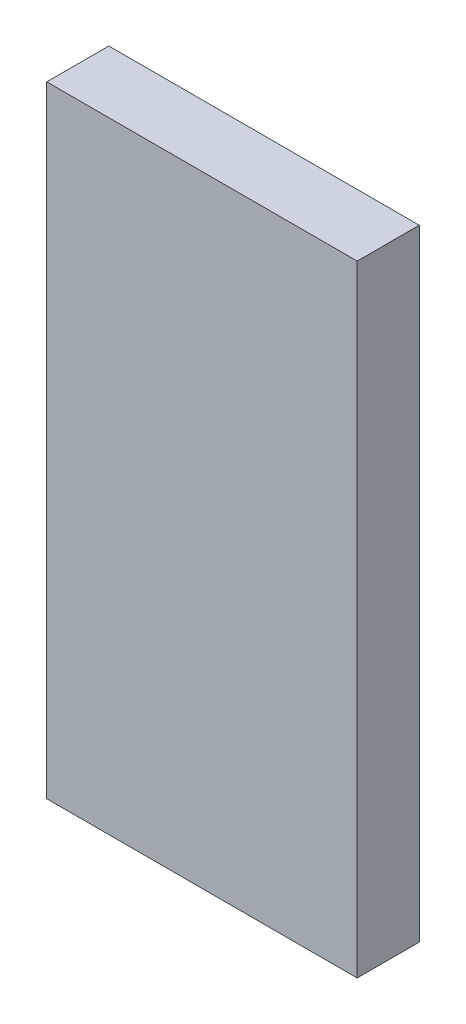
ISO-10303-21;
HEADER;
FILE_DESCRIPTION(('STEP AP214'),'2;1');
FILE_NAME('part.step','',(''),(''),'','','');
FILE_SCHEMA(('AUTOMOTIVE_DESIGN { 1 0 10303 214 1 1 1 1 }'));
ENDSEC;
DATA;
#1=APPLICATION_CONTEXT('core data for automotive mechanical design processes');
#2=APPLICATION_PROTOCOL_DEFINITION('international standard','automotive_design',2000,#1);
#3=PRODUCT_CONTEXT('',#1,'mechanical');
#4=PRODUCT('Part','Part','',(#3));
#5=PRODUCT_RELATED_PRODUCT_CATEGORY('part','',(#4));
#6=PRODUCT_DEFINITION_FORMATION('','',#4);
#7=PRODUCT_DEFINITION_CONTEXT('part definition',#1,'design');
#8=PRODUCT_DEFINITION('design','',#6,#7);
#9=PRODUCT_DEFINITION_SHAPE('','',#8);
#10=(LENGTH_UNIT() NAMED_UNIT(*) SI_UNIT(.MILLI.,.METRE.));
#11=(NAMED_UNIT(*) PLANE_ANGLE_UNIT() SI_UNIT($,.RADIAN.));
#12=(NAMED_UNIT(*) SI_UNIT($,.STERADIAN.) SOLID_ANGLE_UNIT());
#13=UNCERTAINTY_MEASURE_WITH_UNIT(LENGTH_MEASURE(1.E-05),#10,'distance_accuracy_value','');
#14=(GEOMETRIC_REPRESENTATION_CONTEXT(3) GLOBAL_UNCERTAINTY_ASSIGNED_CONTEXT((#13)) GLOBAL_UNIT_ASSIGNED_CONTEXT((#10,
#11,#12)) REPRESENTATION_CONTEXT('',''));
#15=CARTESIAN_POINT('',(0.,0.,0.));
#16=DIRECTION('',(0.,0.,1.));
#17=DIRECTION('',(1.,0.,0.));
#18=AXIS2_PLACEMENT_3D('',#15,#16,#17);
#19=CARTESIAN_POINT('',(12.7,0.,2.54));
#20=DIRECTION('',(0.,1.,0.));
#21=DIRECTION('',(0.,0.,1.));
#22=AXIS2_PLACEMENT_3D('',#19,#20,#21);
#23=PLANE('',#22);
#24=DIRECTION('',(1.,0.,0.));
#25=VECTOR('',#24,1.);
#26=CARTESIAN_POINT('',(12.7,0.,0.));
#27=LINE('',#26,#25);
#28=CARTESIAN_POINT('',(0.,0.,0.));
#29=VERTEX_POINT('',#28);
#30=CARTESIAN_POINT('',(12.7,0.,0.));
#31=VERTEX_POINT('',#30);
#32=EDGE_CURVE('E96',#29,#31,#27,.T.);
#33=ORIENTED_EDGE('',*,*,#32,.T.);
#34=DIRECTION('',(0.,0.,-1.));
#35=VECTOR('',#34,1.);
#36=CARTESIAN_POINT('',(12.7,0.,2.54));
#37=LINE('',#36,#35);
#38=CARTESIAN_POINT('',(12.7,0.,2.54));
#39=VERTEX_POINT('',#38);
#40=EDGE_CURVE('E11',#39,#31,#37,.T.);
#41=ORIENTED_EDGE('',*,*,#40,.F.);
#42=DIRECTION('',(1.,0.,0.));
#43=VECTOR('',#42,1.);
#44=CARTESIAN_POINT('',(12.7,0.,2.54));
#45=LINE('',#44,#43);
#46=CARTESIAN_POINT('',(0.,0.,2.54));
#47=VERTEX_POINT('',#46);
#48=EDGE_CURVE('E84',#47,#39,#45,.T.);
#49=ORIENTED_EDGE('',*,*,#48,.F.);
#50=DIRECTION('',(0.,0.,-1.));
#51=VECTOR('',#50,1.);
#52=CARTESIAN_POINT('',(0.,0.,2.54));
#53=LINE('',#52,#51);
#54=EDGE_CURVE('E92',#47,#29,#53,.T.);
#55=ORIENTED_EDGE('',*,*,#54,.T.);
#56=EDGE_LOOP('',(#33,#41,#49,#55));
#57=FACE_BOUND('',#56,.T.);
#58=ADVANCED_FACE('F33',(#57),#23,.F.);
#59=CARTESIAN_POINT('',(12.7,25.4,2.54));
#60=DIRECTION('',(-1.,0.,0.));
#61=DIRECTION('',(0.,0.,1.));
#62=AXIS2_PLACEMENT_3D('',#59,#60,#61);
#63=PLANE('',#62);
#64=DIRECTION('',(0.,1.,0.));
#65=VECTOR('',#64,1.);
#66=CARTESIAN_POINT('',(12.7,25.4,0.));
#67=LINE('',#66,#65);
#68=CARTESIAN_POINT('',(12.7,25.4,0.));
#69=VERTEX_POINT('',#68);
#70=EDGE_CURVE('E88',#31,#69,#67,.T.);
#71=ORIENTED_EDGE('',*,*,#70,.T.);
#72=DIRECTION('',(0.,0.,-1.));
#73=VECTOR('',#72,1.);
#74=CARTESIAN_POINT('',(12.7,25.4,2.54));
#75=LINE('',#74,#73);
#76=CARTESIAN_POINT('',(12.7,25.4,2.54));
#77=VERTEX_POINT('',#76);
#78=EDGE_CURVE('E41',#77,#69,#75,.T.);
#79=ORIENTED_EDGE('',*,*,#78,.F.);
#80=DIRECTION('',(0.,1.,0.));
#81=VECTOR('',#80,1.);
#82=CARTESIAN_POINT('',(12.7,25.4,2.54));
#83=LINE('',#82,#81);
#84=EDGE_CURVE('E79',#39,#77,#83,.T.);
#85=ORIENTED_EDGE('',*,*,#84,.F.);
#86=ORIENTED_EDGE('',*,*,#40,.T.);
#87=EDGE_LOOP('',(#71,#79,#85,#86));
#88=FACE_BOUND('',#87,.T.);
#89=ADVANCED_FACE('F87',(#88),#63,.F.);
#90=CARTESIAN_POINT('',(0.,25.4,2.54));
#91=DIRECTION('',(0.,-1.,0.));
#92=DIRECTION('',(0.,0.,-1.));
#93=AXIS2_PLACEMENT_3D('',#90,#91,#92);
#94=PLANE('',#93);
#95=DIRECTION('',(-1.,0.,0.));
#96=VECTOR('',#95,1.);
#97=CARTESIAN_POINT('',(0.,25.4,0.));
#98=LINE('',#97,#96);
#99=CARTESIAN_POINT('',(0.,25.4,0.));
#100=VERTEX_POINT('',#99);
#101=EDGE_CURVE('E66',#69,#100,#98,.T.);
#102=ORIENTED_EDGE('',*,*,#101,.T.);
#103=DIRECTION('',(0.,0.,-1.));
#104=VECTOR('',#103,1.);
#105=CARTESIAN_POINT('',(0.,25.4,2.54));
#106=LINE('',#105,#104);
#107=CARTESIAN_POINT('',(0.,25.4,2.54));
#108=VERTEX_POINT('',#107);
#109=EDGE_CURVE('E89',#108,#100,#106,.T.);
#110=ORIENTED_EDGE('',*,*,#109,.F.);
#111=DIRECTION('',(-1.,0.,0.));
#112=VECTOR('',#111,1.);
#113=CARTESIAN_POINT('',(0.,25.4,2.54));
#114=LINE('',#113,#112);
#115=EDGE_CURVE('E82',#77,#108,#114,.T.);
#116=ORIENTED_EDGE('',*,*,#115,.F.);
#117=ORIENTED_EDGE('',*,*,#78,.T.);
#118=EDGE_LOOP('',(#102,#110,#116,#117));
#119=FACE_BOUND('',#118,.T.);
#120=ADVANCED_FACE('F90',(#119),#94,.F.);
#121=CARTESIAN_POINT('',(0.,0.,2.54));
#122=DIRECTION('',(1.,0.,0.));
#123=DIRECTION('',(0.,0.,-1.));
#124=AXIS2_PLACEMENT_3D('',#121,#122,#123);
#125=PLANE('',#124);
#126=DIRECTION('',(0.,-1.,0.));
#127=VECTOR('',#126,1.);
#128=CARTESIAN_POINT('',(0.,0.,0.));
#129=LINE('',#128,#127);
#130=EDGE_CURVE('E72',#100,#29,#129,.T.);
#131=ORIENTED_EDGE('',*,*,#130,.T.);
#132=ORIENTED_EDGE('',*,*,#54,.F.);
#133=DIRECTION('',(0.,-1.,0.));
#134=VECTOR('',#133,1.);
#135=CARTESIAN_POINT('',(0.,0.,2.54));
#136=LINE('',#135,#134);
#137=EDGE_CURVE('E49',#108,#47,#136,.T.);
#138=ORIENTED_EDGE('',*,*,#137,.F.);
#139=ORIENTED_EDGE('',*,*,#109,.T.);
#140=EDGE_LOOP('',(#131,#132,#138,#139));
#141=FACE_BOUND('',#140,.T.);
#142=ADVANCED_FACE('F103',(#141),#125,.F.);
#143=CARTESIAN_POINT('',(0.,0.,2.54));
#144=DIRECTION('',(0.,0.,-1.));
#145=DIRECTION('',(-1.,0.,0.));
#146=AXIS2_PLACEMENT_3D('',#143,#144,#145);
#147=PLANE('',#146);
#148=ORIENTED_EDGE('',*,*,#48,.T.);
#149=ORIENTED_EDGE('',*,*,#84,.T.);
#150=ORIENTED_EDGE('',*,*,#115,.T.);
#151=ORIENTED_EDGE('',*,*,#137,.T.);
#152=EDGE_LOOP('',(#148,#149,#150,#151));
#153=FACE_BOUND('',#152,.T.);
#154=ADVANCED_FACE('F80',(#153),#147,.F.);
#155=CARTESIAN_POINT('',(0.,0.,0.));
#156=DIRECTION('',(0.,0.,-1.));
#157=DIRECTION('',(-1.,0.,0.));
#158=AXIS2_PLACEMENT_3D('',#155,#156,#157);
#159=PLANE('',#158);
#160=ORIENTED_EDGE('',*,*,#32,.F.);
#161=ORIENTED_EDGE('',*,*,#130,.F.);
#162=ORIENTED_EDGE('',*,*,#101,.F.);
#163=ORIENTED_EDGE('',*,*,#70,.F.);
#164=EDGE_LOOP('',(#160,#161,#162,#163));
#165=FACE_BOUND('',#164,.T.);
#166=ADVANCED_FACE('F106',(#165),#159,.T.);
#167=CLOSED_SHELL('',(#58,#89,#120,#142,#154,#166));
#168=MANIFOLD_SOLID_BREP('B2',#167);
#169=ADVANCED_BREP_SHAPE_REPRESENTATION('',(#18,#168),#14);
#170=SHAPE_DEFINITION_REPRESENTATION(#9,#169);
ENDSEC;
END-ISO-10303-21;
